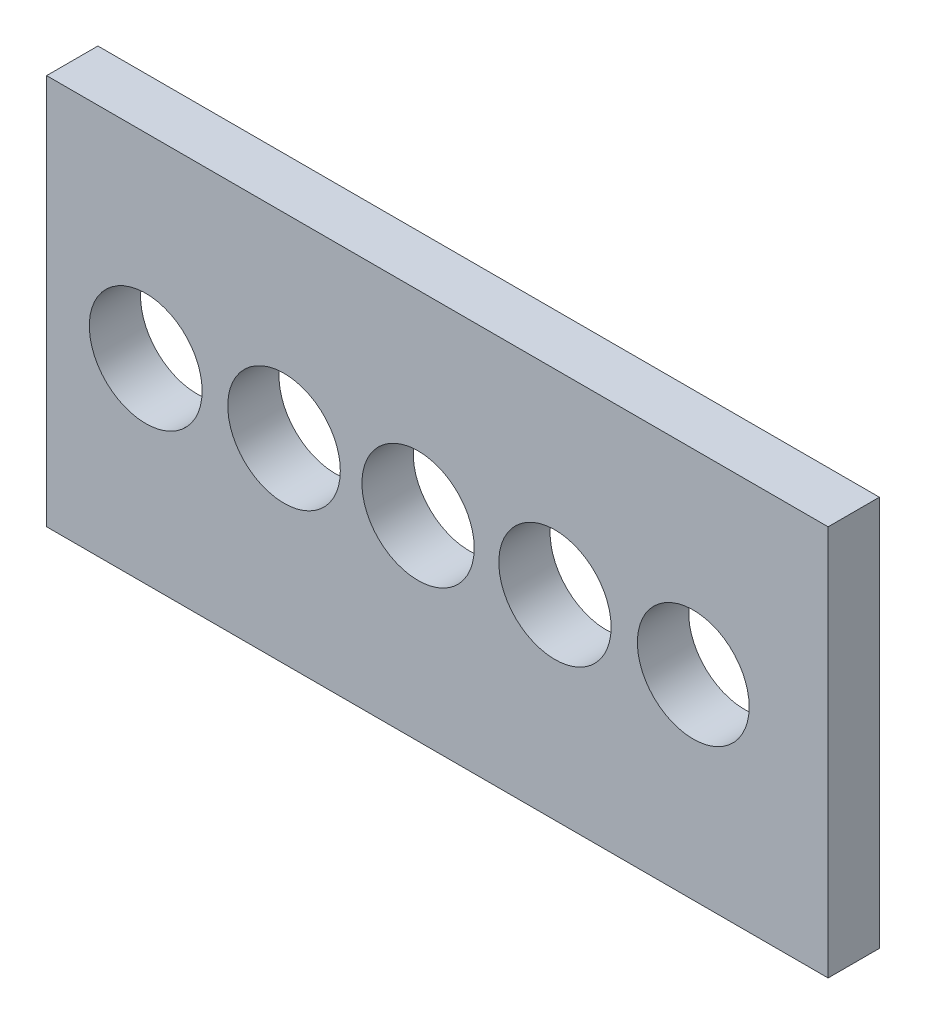
ISO-10303-21;
HEADER;
FILE_DESCRIPTION(('STEP AP214'),'2;1');
FILE_NAME('part.step','',(''),(''),'','','');
FILE_SCHEMA(('AUTOMOTIVE_DESIGN { 1 0 10303 214 1 1 1 1 }'));
ENDSEC;
DATA;
#1=APPLICATION_CONTEXT('core data for automotive mechanical design processes');
#2=APPLICATION_PROTOCOL_DEFINITION('international standard','automotive_design',2000,#1);
#3=PRODUCT_CONTEXT('',#1,'mechanical');
#4=PRODUCT('Part','Part','',(#3));
#5=PRODUCT_RELATED_PRODUCT_CATEGORY('part','',(#4));
#6=PRODUCT_DEFINITION_FORMATION('','',#4);
#7=PRODUCT_DEFINITION_CONTEXT('part definition',#1,'design');
#8=PRODUCT_DEFINITION('design','',#6,#7);
#9=PRODUCT_DEFINITION_SHAPE('','',#8);
#10=(LENGTH_UNIT() NAMED_UNIT(*) SI_UNIT(.MILLI.,.METRE.));
#11=(NAMED_UNIT(*) PLANE_ANGLE_UNIT() SI_UNIT($,.RADIAN.));
#12=(NAMED_UNIT(*) SI_UNIT($,.STERADIAN.) SOLID_ANGLE_UNIT());
#13=UNCERTAINTY_MEASURE_WITH_UNIT(LENGTH_MEASURE(1.E-05),#10,'distance_accuracy_value','');
#14=(GEOMETRIC_REPRESENTATION_CONTEXT(3) GLOBAL_UNCERTAINTY_ASSIGNED_CONTEXT((#13)) GLOBAL_UNIT_ASSIGNED_CONTEXT((#10,
#11,#12)) REPRESENTATION_CONTEXT('',''));
#15=CARTESIAN_POINT('',(0.,0.,0.));
#16=DIRECTION('',(0.,0.,1.));
#17=DIRECTION('',(1.,0.,0.));
#18=AXIS2_PLACEMENT_3D('',#15,#16,#17);
#19=CARTESIAN_POINT('',(0.,0.,10.));
#20=DIRECTION('',(0.,0.,1.));
#21=DIRECTION('',(1.,0.,0.));
#22=AXIS2_PLACEMENT_3D('',#19,#20,#21);
#23=PLANE('',#22);
#24=CARTESIAN_POINT('',(99.1342468054052,-38.1,10.));
#25=DIRECTION('',(0.,0.,1.));
#26=DIRECTION('',(1.,0.,0.));
#27=AXIS2_PLACEMENT_3D('',#24,#25,#26);
#28=CIRCLE('',#27,10.95);
#29=CARTESIAN_POINT('',(110.084246805405,-38.1,10.));
#30=VERTEX_POINT('',#29);
#31=EDGE_CURVE('E150',#30,#30,#28,.T.);
#32=ORIENTED_EDGE('',*,*,#31,.F.);
#33=EDGE_LOOP('',(#32));
#34=FACE_BOUND('',#33,.T.);
#35=CARTESIAN_POINT('',(46.2997253663393,-38.1,10.));
#36=DIRECTION('',(0.,0.,1.));
#37=DIRECTION('',(1.,0.,0.));
#38=AXIS2_PLACEMENT_3D('',#35,#36,#37);
#39=CIRCLE('',#38,10.975);
#40=CARTESIAN_POINT('',(57.2747253663393,-38.1,10.));
#41=VERTEX_POINT('',#40);
#42=EDGE_CURVE('E134',#41,#41,#39,.T.);
#43=ORIENTED_EDGE('',*,*,#42,.F.);
#44=EDGE_LOOP('',(#43));
#45=FACE_BOUND('',#44,.T.);
#46=DIRECTION('',(0.,-1.,0.));
#47=VECTOR('',#46,1.);
#48=CARTESIAN_POINT('',(0.,0.,10.));
#49=LINE('',#48,#47);
#50=CARTESIAN_POINT('',(0.,0.,10.));
#51=VERTEX_POINT('',#50);
#52=CARTESIAN_POINT('',(0.,-76.2,10.));
#53=VERTEX_POINT('',#52);
#54=EDGE_CURVE('E92',#51,#53,#49,.T.);
#55=ORIENTED_EDGE('',*,*,#54,.T.);
#56=DIRECTION('',(1.,0.,0.));
#57=VECTOR('',#56,1.);
#58=CARTESIAN_POINT('',(0.,-76.2,10.));
#59=LINE('',#58,#57);
#60=CARTESIAN_POINT('',(152.4,-76.2,10.));
#61=VERTEX_POINT('',#60);
#62=EDGE_CURVE('E87',#53,#61,#59,.T.);
#63=ORIENTED_EDGE('',*,*,#62,.T.);
#64=DIRECTION('',(0.,1.,0.));
#65=VECTOR('',#64,1.);
#66=CARTESIAN_POINT('',(152.4,0.,10.));
#67=LINE('',#66,#65);
#68=CARTESIAN_POINT('',(152.4,0.,10.));
#69=VERTEX_POINT('',#68);
#70=EDGE_CURVE('E90',#61,#69,#67,.T.);
#71=ORIENTED_EDGE('',*,*,#70,.T.);
#72=DIRECTION('',(-1.,0.,0.));
#73=VECTOR('',#72,1.);
#74=CARTESIAN_POINT('',(0.,0.,10.));
#75=LINE('',#74,#73);
#76=EDGE_CURVE('E57',#69,#51,#75,.T.);
#77=ORIENTED_EDGE('',*,*,#76,.T.);
#78=EDGE_LOOP('',(#55,#63,#71,#77));
#79=FACE_BOUND('',#78,.T.);
#80=CARTESIAN_POINT('',(19.3263117895531,-38.1,10.));
#81=DIRECTION('',(0.,0.,1.));
#82=DIRECTION('',(1.,0.,0.));
#83=AXIS2_PLACEMENT_3D('',#80,#81,#82);
#84=CIRCLE('',#83,10.999999971);
#85=CARTESIAN_POINT('',(30.3263117605531,-38.1,10.));
#86=VERTEX_POINT('',#85);
#87=EDGE_CURVE('E112',#86,#86,#84,.T.);
#88=ORIENTED_EDGE('',*,*,#87,.F.);
#89=EDGE_LOOP('',(#88));
#90=FACE_BOUND('',#89,.T.);
#91=CARTESIAN_POINT('',(72.4389096572456,-38.1,10.));
#92=DIRECTION('',(0.,0.,1.));
#93=DIRECTION('',(1.,0.,0.));
#94=AXIS2_PLACEMENT_3D('',#91,#92,#93);
#95=CIRCLE('',#94,10.95);
#96=CARTESIAN_POINT('',(83.3889096572456,-38.1,10.));
#97=VERTEX_POINT('',#96);
#98=EDGE_CURVE('E142',#97,#97,#95,.T.);
#99=ORIENTED_EDGE('',*,*,#98,.F.);
#100=EDGE_LOOP('',(#99));
#101=FACE_BOUND('',#100,.T.);
#102=CARTESIAN_POINT('',(126.107660382191,-38.1,10.));
#103=DIRECTION('',(0.,0.,1.));
#104=DIRECTION('',(1.,0.,0.));
#105=AXIS2_PLACEMENT_3D('',#102,#103,#104);
#106=CIRCLE('',#105,10.9);
#107=CARTESIAN_POINT('',(137.007660382191,-38.1,10.));
#108=VERTEX_POINT('',#107);
#109=EDGE_CURVE('E158',#108,#108,#106,.T.);
#110=ORIENTED_EDGE('',*,*,#109,.F.);
#111=EDGE_LOOP('',(#110));
#112=FACE_BOUND('',#111,.T.);
#113=ADVANCED_FACE('F39',(#34,#45,#79,#90,#101,#112),#23,.T.);
#114=CARTESIAN_POINT('',(0.,0.,0.));
#115=DIRECTION('',(0.,0.,1.));
#116=DIRECTION('',(1.,0.,0.));
#117=AXIS2_PLACEMENT_3D('',#114,#115,#116);
#118=PLANE('',#117);
#119=DIRECTION('',(0.,-1.,0.));
#120=VECTOR('',#119,1.);
#121=CARTESIAN_POINT('',(0.,0.,0.));
#122=LINE('',#121,#120);
#123=CARTESIAN_POINT('',(0.,0.,0.));
#124=VERTEX_POINT('',#123);
#125=CARTESIAN_POINT('',(0.,-76.2,0.));
#126=VERTEX_POINT('',#125);
#127=EDGE_CURVE('E108',#124,#126,#122,.T.);
#128=ORIENTED_EDGE('',*,*,#127,.F.);
#129=DIRECTION('',(-1.,0.,0.));
#130=VECTOR('',#129,1.);
#131=CARTESIAN_POINT('',(0.,0.,0.));
#132=LINE('',#131,#130);
#133=CARTESIAN_POINT('',(152.4,0.,0.));
#134=VERTEX_POINT('',#133);
#135=EDGE_CURVE('E80',#134,#124,#132,.T.);
#136=ORIENTED_EDGE('',*,*,#135,.F.);
#137=DIRECTION('',(0.,1.,0.));
#138=VECTOR('',#137,1.);
#139=CARTESIAN_POINT('',(152.4,0.,0.));
#140=LINE('',#139,#138);
#141=CARTESIAN_POINT('',(152.4,-76.2,0.));
#142=VERTEX_POINT('',#141);
#143=EDGE_CURVE('E74',#142,#134,#140,.T.);
#144=ORIENTED_EDGE('',*,*,#143,.F.);
#145=DIRECTION('',(1.,0.,0.));
#146=VECTOR('',#145,1.);
#147=CARTESIAN_POINT('',(0.,-76.2,0.));
#148=LINE('',#147,#146);
#149=EDGE_CURVE('E97',#126,#142,#148,.T.);
#150=ORIENTED_EDGE('',*,*,#149,.F.);
#151=EDGE_LOOP('',(#128,#136,#144,#150));
#152=FACE_BOUND('',#151,.T.);
#153=CARTESIAN_POINT('',(19.3263117895531,-38.1,0.));
#154=DIRECTION('',(0.,0.,1.));
#155=DIRECTION('',(1.,0.,0.));
#156=AXIS2_PLACEMENT_3D('',#153,#154,#155);
#157=CIRCLE('',#156,10.999999971);
#158=CARTESIAN_POINT('',(30.3263117605531,-38.1,0.));
#159=VERTEX_POINT('',#158);
#160=EDGE_CURVE('E130',#159,#159,#157,.T.);
#161=ORIENTED_EDGE('',*,*,#160,.T.);
#162=EDGE_LOOP('',(#161));
#163=FACE_BOUND('',#162,.T.);
#164=CARTESIAN_POINT('',(46.2997253663393,-38.1,0.));
#165=DIRECTION('',(0.,0.,1.));
#166=DIRECTION('',(1.,0.,0.));
#167=AXIS2_PLACEMENT_3D('',#164,#165,#166);
#168=CIRCLE('',#167,10.975);
#169=CARTESIAN_POINT('',(57.2747253663393,-38.1,0.));
#170=VERTEX_POINT('',#169);
#171=EDGE_CURVE('E138',#170,#170,#168,.T.);
#172=ORIENTED_EDGE('',*,*,#171,.T.);
#173=EDGE_LOOP('',(#172));
#174=FACE_BOUND('',#173,.T.);
#175=CARTESIAN_POINT('',(72.4389096572456,-38.1,0.));
#176=DIRECTION('',(0.,0.,1.));
#177=DIRECTION('',(1.,0.,0.));
#178=AXIS2_PLACEMENT_3D('',#175,#176,#177);
#179=CIRCLE('',#178,10.95);
#180=CARTESIAN_POINT('',(83.3889096572456,-38.1,0.));
#181=VERTEX_POINT('',#180);
#182=EDGE_CURVE('E146',#181,#181,#179,.T.);
#183=ORIENTED_EDGE('',*,*,#182,.T.);
#184=EDGE_LOOP('',(#183));
#185=FACE_BOUND('',#184,.T.);
#186=CARTESIAN_POINT('',(99.1342468054052,-38.1,0.));
#187=DIRECTION('',(0.,0.,1.));
#188=DIRECTION('',(1.,0.,0.));
#189=AXIS2_PLACEMENT_3D('',#186,#187,#188);
#190=CIRCLE('',#189,10.95);
#191=CARTESIAN_POINT('',(110.084246805405,-38.1,0.));
#192=VERTEX_POINT('',#191);
#193=EDGE_CURVE('E154',#192,#192,#190,.T.);
#194=ORIENTED_EDGE('',*,*,#193,.T.);
#195=EDGE_LOOP('',(#194));
#196=FACE_BOUND('',#195,.T.);
#197=CARTESIAN_POINT('',(126.107660382191,-38.1,0.));
#198=DIRECTION('',(0.,0.,1.));
#199=DIRECTION('',(1.,0.,0.));
#200=AXIS2_PLACEMENT_3D('',#197,#198,#199);
#201=CIRCLE('',#200,10.9);
#202=CARTESIAN_POINT('',(137.007660382191,-38.1,0.));
#203=VERTEX_POINT('',#202);
#204=EDGE_CURVE('E162',#203,#203,#201,.T.);
#205=ORIENTED_EDGE('',*,*,#204,.T.);
#206=EDGE_LOOP('',(#205));
#207=FACE_BOUND('',#206,.T.);
#208=ADVANCED_FACE('F125',(#152,#163,#174,#185,#196,#207),#118,.F.);
#209=CARTESIAN_POINT('',(0.,0.,10.));
#210=DIRECTION('',(1.,0.,0.));
#211=DIRECTION('',(0.,1.,0.));
#212=AXIS2_PLACEMENT_3D('',#209,#210,#211);
#213=PLANE('',#212);
#214=ORIENTED_EDGE('',*,*,#127,.T.);
#215=DIRECTION('',(0.,0.,-1.));
#216=VECTOR('',#215,1.);
#217=CARTESIAN_POINT('',(0.,-76.2,10.));
#218=LINE('',#217,#216);
#219=EDGE_CURVE('E11',#53,#126,#218,.T.);
#220=ORIENTED_EDGE('',*,*,#219,.F.);
#221=ORIENTED_EDGE('',*,*,#54,.F.);
#222=DIRECTION('',(0.,0.,-1.));
#223=VECTOR('',#222,1.);
#224=CARTESIAN_POINT('',(0.,0.,10.));
#225=LINE('',#224,#223);
#226=EDGE_CURVE('E104',#51,#124,#225,.T.);
#227=ORIENTED_EDGE('',*,*,#226,.T.);
#228=EDGE_LOOP('',(#214,#220,#221,#227));
#229=FACE_BOUND('',#228,.T.);
#230=ADVANCED_FACE('F41',(#229),#213,.F.);
#231=CARTESIAN_POINT('',(0.,-76.2,10.));
#232=DIRECTION('',(0.,1.,0.));
#233=DIRECTION('',(0.,0.,1.));
#234=AXIS2_PLACEMENT_3D('',#231,#232,#233);
#235=PLANE('',#234);
#236=ORIENTED_EDGE('',*,*,#149,.T.);
#237=DIRECTION('',(0.,0.,-1.));
#238=VECTOR('',#237,1.);
#239=CARTESIAN_POINT('',(152.4,-76.2,10.));
#240=LINE('',#239,#238);
#241=EDGE_CURVE('E49',#61,#142,#240,.T.);
#242=ORIENTED_EDGE('',*,*,#241,.F.);
#243=ORIENTED_EDGE('',*,*,#62,.F.);
#244=ORIENTED_EDGE('',*,*,#219,.T.);
#245=EDGE_LOOP('',(#236,#242,#243,#244));
#246=FACE_BOUND('',#245,.T.);
#247=ADVANCED_FACE('F96',(#246),#235,.F.);
#248=CARTESIAN_POINT('',(152.4,0.,10.));
#249=DIRECTION('',(-1.,0.,0.));
#250=DIRECTION('',(0.,0.,1.));
#251=AXIS2_PLACEMENT_3D('',#248,#249,#250);
#252=PLANE('',#251);
#253=ORIENTED_EDGE('',*,*,#143,.T.);
#254=DIRECTION('',(0.,0.,-1.));
#255=VECTOR('',#254,1.);
#256=CARTESIAN_POINT('',(152.4,0.,10.));
#257=LINE('',#256,#255);
#258=EDGE_CURVE('E99',#69,#134,#257,.T.);
#259=ORIENTED_EDGE('',*,*,#258,.F.);
#260=ORIENTED_EDGE('',*,*,#70,.F.);
#261=ORIENTED_EDGE('',*,*,#241,.T.);
#262=EDGE_LOOP('',(#253,#259,#260,#261));
#263=FACE_BOUND('',#262,.T.);
#264=ADVANCED_FACE('F100',(#263),#252,.F.);
#265=CARTESIAN_POINT('',(0.,0.,10.));
#266=DIRECTION('',(0.,-1.,0.));
#267=DIRECTION('',(0.,0.,-1.));
#268=AXIS2_PLACEMENT_3D('',#265,#266,#267);
#269=PLANE('',#268);
#270=ORIENTED_EDGE('',*,*,#135,.T.);
#271=ORIENTED_EDGE('',*,*,#226,.F.);
#272=ORIENTED_EDGE('',*,*,#76,.F.);
#273=ORIENTED_EDGE('',*,*,#258,.T.);
#274=EDGE_LOOP('',(#270,#271,#272,#273));
#275=FACE_BOUND('',#274,.T.);
#276=ADVANCED_FACE('F122',(#275),#269,.F.);
#277=CARTESIAN_POINT('',(19.3263117895531,-38.1,10.));
#278=DIRECTION('',(0.,0.,-1.));
#279=DIRECTION('',(-1.,0.,0.));
#280=AXIS2_PLACEMENT_3D('',#277,#278,#279);
#281=CYLINDRICAL_SURFACE('',#280,10.999999971);
#282=ORIENTED_EDGE('',*,*,#87,.T.);
#283=EDGE_LOOP('',(#282));
#284=FACE_BOUND('',#283,.T.);
#285=ORIENTED_EDGE('',*,*,#160,.F.);
#286=EDGE_LOOP('',(#285));
#287=FACE_BOUND('',#286,.T.);
#288=ADVANCED_FACE('F183',(#284,#287),#281,.F.);
#289=CARTESIAN_POINT('',(46.2997253663393,-38.1,10.));
#290=DIRECTION('',(0.,0.,-1.));
#291=DIRECTION('',(-1.,0.,0.));
#292=AXIS2_PLACEMENT_3D('',#289,#290,#291);
#293=CYLINDRICAL_SURFACE('',#292,10.975);
#294=ORIENTED_EDGE('',*,*,#42,.T.);
#295=EDGE_LOOP('',(#294));
#296=FACE_BOUND('',#295,.T.);
#297=ORIENTED_EDGE('',*,*,#171,.F.);
#298=EDGE_LOOP('',(#297));
#299=FACE_BOUND('',#298,.T.);
#300=ADVANCED_FACE('F229',(#296,#299),#293,.F.);
#301=CARTESIAN_POINT('',(72.4389096572456,-38.1,10.));
#302=DIRECTION('',(0.,0.,-1.));
#303=DIRECTION('',(-1.,0.,0.));
#304=AXIS2_PLACEMENT_3D('',#301,#302,#303);
#305=CYLINDRICAL_SURFACE('',#304,10.95);
#306=ORIENTED_EDGE('',*,*,#98,.T.);
#307=EDGE_LOOP('',(#306));
#308=FACE_BOUND('',#307,.T.);
#309=ORIENTED_EDGE('',*,*,#182,.F.);
#310=EDGE_LOOP('',(#309));
#311=FACE_BOUND('',#310,.T.);
#312=ADVANCED_FACE('F237',(#308,#311),#305,.F.);
#313=CARTESIAN_POINT('',(99.1342468054052,-38.1,10.));
#314=DIRECTION('',(0.,0.,-1.));
#315=DIRECTION('',(-1.,0.,0.));
#316=AXIS2_PLACEMENT_3D('',#313,#314,#315);
#317=CYLINDRICAL_SURFACE('',#316,10.95);
#318=ORIENTED_EDGE('',*,*,#31,.T.);
#319=EDGE_LOOP('',(#318));
#320=FACE_BOUND('',#319,.T.);
#321=ORIENTED_EDGE('',*,*,#193,.F.);
#322=EDGE_LOOP('',(#321));
#323=FACE_BOUND('',#322,.T.);
#324=ADVANCED_FACE('F245',(#320,#323),#317,.F.);
#325=CARTESIAN_POINT('',(126.107660382191,-38.1,10.));
#326=DIRECTION('',(0.,0.,-1.));
#327=DIRECTION('',(-1.,0.,0.));
#328=AXIS2_PLACEMENT_3D('',#325,#326,#327);
#329=CYLINDRICAL_SURFACE('',#328,10.9);
#330=ORIENTED_EDGE('',*,*,#109,.T.);
#331=EDGE_LOOP('',(#330));
#332=FACE_BOUND('',#331,.T.);
#333=ORIENTED_EDGE('',*,*,#204,.F.);
#334=EDGE_LOOP('',(#333));
#335=FACE_BOUND('',#334,.T.);
#336=ADVANCED_FACE('F170',(#332,#335),#329,.F.);
#337=CLOSED_SHELL('',(#113,#208,#230,#247,#264,#276,#288,#300,#312,#324,#336));
#338=MANIFOLD_SOLID_BREP('B2',#337);
#339=ADVANCED_BREP_SHAPE_REPRESENTATION('',(#18,#338),#14);
#340=SHAPE_DEFINITION_REPRESENTATION(#9,#339);
ENDSEC;
END-ISO-10303-21;
